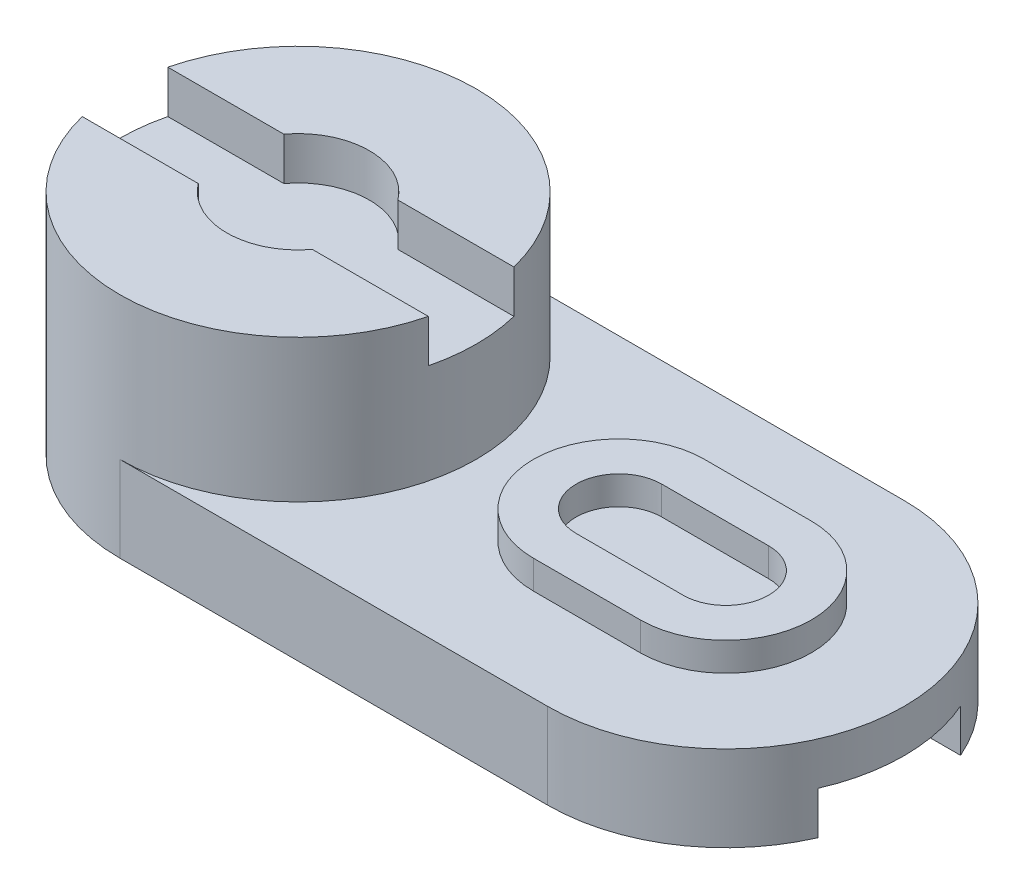
ISO-10303-21;
HEADER;
FILE_DESCRIPTION(('STEP AP214'),'2;1');
FILE_NAME('part.step','',(''),(''),'','','');
FILE_SCHEMA(('AUTOMOTIVE_DESIGN { 1 0 10303 214 1 1 1 1 }'));
ENDSEC;
DATA;
#1=APPLICATION_CONTEXT('core data for automotive mechanical design processes');
#2=APPLICATION_PROTOCOL_DEFINITION('international standard','automotive_design',2000,#1);
#3=PRODUCT_CONTEXT('',#1,'mechanical');
#4=PRODUCT('Part','Part','',(#3));
#5=PRODUCT_RELATED_PRODUCT_CATEGORY('part','',(#4));
#6=PRODUCT_DEFINITION_FORMATION('','',#4);
#7=PRODUCT_DEFINITION_CONTEXT('part definition',#1,'design');
#8=PRODUCT_DEFINITION('design','',#6,#7);
#9=PRODUCT_DEFINITION_SHAPE('','',#8);
#10=(LENGTH_UNIT() NAMED_UNIT(*) SI_UNIT(.MILLI.,.METRE.));
#11=(NAMED_UNIT(*) PLANE_ANGLE_UNIT() SI_UNIT($,.RADIAN.));
#12=(NAMED_UNIT(*) SI_UNIT($,.STERADIAN.) SOLID_ANGLE_UNIT());
#13=UNCERTAINTY_MEASURE_WITH_UNIT(LENGTH_MEASURE(1.E-05),#10,'distance_accuracy_value','');
#14=(GEOMETRIC_REPRESENTATION_CONTEXT(3) GLOBAL_UNCERTAINTY_ASSIGNED_CONTEXT((#13)) GLOBAL_UNIT_ASSIGNED_CONTEXT((#10,
#11,#12)) REPRESENTATION_CONTEXT('',''));
#15=CARTESIAN_POINT('',(0.,0.,0.));
#16=DIRECTION('',(0.,0.,1.));
#17=DIRECTION('',(1.,0.,0.));
#18=AXIS2_PLACEMENT_3D('',#15,#16,#17);
#19=CARTESIAN_POINT('',(-30.,0.,0.));
#20=DIRECTION('',(0.,1.,0.));
#21=DIRECTION('',(0.,0.,1.));
#22=AXIS2_PLACEMENT_3D('',#19,#20,#21);
#23=PLANE('',#22);
#24=CARTESIAN_POINT('',(30.,0.,0.));
#25=DIRECTION('',(0.,1.,0.));
#26=DIRECTION('',(0.,0.,1.));
#27=AXIS2_PLACEMENT_3D('',#24,#25,#26);
#28=CIRCLE('',#27,25.);
#29=CARTESIAN_POINT('',(52.9128784747792,0.,-10.));
#30=VERTEX_POINT('',#29);
#31=CARTESIAN_POINT('',(30.,0.,-25.));
#32=VERTEX_POINT('',#31);
#33=EDGE_CURVE('E226',#30,#32,#28,.T.);
#34=ORIENTED_EDGE('',*,*,#33,.F.);
#35=DIRECTION('',(-1.,0.,0.));
#36=VECTOR('',#35,1.);
#37=CARTESIAN_POINT('',(-30.,0.,-10.));
#38=LINE('',#37,#36);
#39=CARTESIAN_POINT('',(-52.9128784747792,0.,-10.));
#40=VERTEX_POINT('',#39);
#41=EDGE_CURVE('E41',#30,#40,#38,.T.);
#42=ORIENTED_EDGE('',*,*,#41,.T.);
#43=CARTESIAN_POINT('',(-30.,0.,0.));
#44=DIRECTION('',(0.,1.,0.));
#45=DIRECTION('',(0.,0.,1.));
#46=AXIS2_PLACEMENT_3D('',#43,#44,#45);
#47=CIRCLE('',#46,25.);
#48=CARTESIAN_POINT('',(-30.,0.,-25.));
#49=VERTEX_POINT('',#48);
#50=EDGE_CURVE('E215',#49,#40,#47,.T.);
#51=ORIENTED_EDGE('',*,*,#50,.F.);
#52=DIRECTION('',(-1.,0.,0.));
#53=VECTOR('',#52,1.);
#54=CARTESIAN_POINT('',(-30.,0.,-25.));
#55=LINE('',#54,#53);
#56=EDGE_CURVE('E229',#32,#49,#55,.T.);
#57=ORIENTED_EDGE('',*,*,#56,.F.);
#58=EDGE_LOOP('',(#34,#42,#51,#57));
#59=FACE_BOUND('',#58,.T.);
#60=ADVANCED_FACE('F33',(#59),#23,.F.);
#61=CARTESIAN_POINT('',(-57.5,26.,6.));
#62=DIRECTION('',(0.,0.,1.));
#63=DIRECTION('',(1.,0.,0.));
#64=AXIS2_PLACEMENT_3D('',#61,#62,#63);
#65=PLANE('',#64);
#66=DIRECTION('',(0.,-1.,0.));
#67=VECTOR('',#66,1.);
#68=CARTESIAN_POINT('',(-38.,43.,6.));
#69=LINE('',#68,#67);
#70=CARTESIAN_POINT('',(-38.,26.,6.));
#71=VERTEX_POINT('',#70);
#72=CARTESIAN_POINT('',(-38.,32.,6.));
#73=VERTEX_POINT('',#72);
#74=EDGE_CURVE('E295',#71,#73,#69,.F.);
#75=ORIENTED_EDGE('',*,*,#74,.F.);
#76=DIRECTION('',(1.,0.,0.));
#77=VECTOR('',#76,1.);
#78=CARTESIAN_POINT('',(-57.5,26.,6.));
#79=LINE('',#78,#77);
#80=CARTESIAN_POINT('',(-54.2693221990232,26.,6.));
#81=VERTEX_POINT('',#80);
#82=EDGE_CURVE('E302',#81,#71,#79,.T.);
#83=ORIENTED_EDGE('',*,*,#82,.F.);
#84=DIRECTION('',(0.,-1.,0.));
#85=VECTOR('',#84,1.);
#86=CARTESIAN_POINT('',(-54.2693221990232,12.,6.));
#87=LINE('',#86,#85);
#88=CARTESIAN_POINT('',(-54.2693221990232,32.,6.));
#89=VERTEX_POINT('',#88);
#90=EDGE_CURVE('E313',#89,#81,#87,.T.);
#91=ORIENTED_EDGE('',*,*,#90,.F.);
#92=DIRECTION('',(1.,0.,0.));
#93=VECTOR('',#92,1.);
#94=CARTESIAN_POINT('',(-30.,32.,6.));
#95=LINE('',#94,#93);
#96=EDGE_CURVE('E248',#89,#73,#95,.T.);
#97=ORIENTED_EDGE('',*,*,#96,.T.);
#98=EDGE_LOOP('',(#75,#83,#91,#97));
#99=FACE_BOUND('',#98,.T.);
#100=ADVANCED_FACE('F400',(#99),#65,.F.);
#101=DIRECTION('',(0.,-1.,0.));
#102=VECTOR('',#101,1.);
#103=CARTESIAN_POINT('',(-22.,43.,6.));
#104=LINE('',#103,#102);
#105=CARTESIAN_POINT('',(-22.,32.,6.));
#106=VERTEX_POINT('',#105);
#107=CARTESIAN_POINT('',(-22.,26.,6.));
#108=VERTEX_POINT('',#107);
#109=EDGE_CURVE('E290',#106,#108,#104,.T.);
#110=ORIENTED_EDGE('',*,*,#109,.F.);
#111=CARTESIAN_POINT('',(-5.7306778009768,32.,6.));
#112=VERTEX_POINT('',#111);
#113=EDGE_CURVE('E247',#106,#112,#95,.T.);
#114=ORIENTED_EDGE('',*,*,#113,.T.);
#115=DIRECTION('',(0.,-1.,0.));
#116=VECTOR('',#115,1.);
#117=CARTESIAN_POINT('',(-5.7306778009768,12.,6.));
#118=LINE('',#117,#116);
#119=CARTESIAN_POINT('',(-5.7306778009768,26.,6.));
#120=VERTEX_POINT('',#119);
#121=EDGE_CURVE('E310',#120,#112,#118,.F.);
#122=ORIENTED_EDGE('',*,*,#121,.F.);
#123=EDGE_CURVE('E301',#108,#120,#79,.T.);
#124=ORIENTED_EDGE('',*,*,#123,.F.);
#125=EDGE_LOOP('',(#110,#114,#122,#124));
#126=FACE_BOUND('',#125,.T.);
#127=ADVANCED_FACE('F405',(#126),#65,.F.);
#128=CARTESIAN_POINT('',(-57.5,26.,-6.));
#129=DIRECTION('',(0.,0.,-1.));
#130=DIRECTION('',(-1.,0.,0.));
#131=AXIS2_PLACEMENT_3D('',#128,#129,#130);
#132=PLANE('',#131);
#133=DIRECTION('',(0.,-1.,0.));
#134=VECTOR('',#133,1.);
#135=CARTESIAN_POINT('',(-22.,43.,-6.));
#136=LINE('',#135,#134);
#137=CARTESIAN_POINT('',(-22.,26.,-6.));
#138=VERTEX_POINT('',#137);
#139=CARTESIAN_POINT('',(-22.,32.,-6.));
#140=VERTEX_POINT('',#139);
#141=EDGE_CURVE('E200',#138,#140,#136,.F.);
#142=ORIENTED_EDGE('',*,*,#141,.F.);
#143=DIRECTION('',(-1.,0.,0.));
#144=VECTOR('',#143,1.);
#145=CARTESIAN_POINT('',(-57.5,26.,-6.));
#146=LINE('',#145,#144);
#147=CARTESIAN_POINT('',(-5.7306778009768,26.,-6.));
#148=VERTEX_POINT('',#147);
#149=EDGE_CURVE('E298',#148,#138,#146,.T.);
#150=ORIENTED_EDGE('',*,*,#149,.F.);
#151=DIRECTION('',(0.,-1.,0.));
#152=VECTOR('',#151,1.);
#153=CARTESIAN_POINT('',(-5.7306778009768,12.,-6.));
#154=LINE('',#153,#152);
#155=CARTESIAN_POINT('',(-5.73067780097679,32.,-6.));
#156=VERTEX_POINT('',#155);
#157=EDGE_CURVE('E307',#156,#148,#154,.T.);
#158=ORIENTED_EDGE('',*,*,#157,.F.);
#159=DIRECTION('',(-1.,0.,0.));
#160=VECTOR('',#159,1.);
#161=CARTESIAN_POINT('',(-30.,32.,-6.));
#162=LINE('',#161,#160);
#163=EDGE_CURVE('E244',#156,#140,#162,.T.);
#164=ORIENTED_EDGE('',*,*,#163,.T.);
#165=EDGE_LOOP('',(#142,#150,#158,#164));
#166=FACE_BOUND('',#165,.T.);
#167=ADVANCED_FACE('F563',(#166),#132,.F.);
#168=DIRECTION('',(0.,-1.,0.));
#169=VECTOR('',#168,1.);
#170=CARTESIAN_POINT('',(-38.,43.,-6.));
#171=LINE('',#170,#169);
#172=CARTESIAN_POINT('',(-38.,32.,-6.));
#173=VERTEX_POINT('',#172);
#174=CARTESIAN_POINT('',(-38.,26.,-6.));
#175=VERTEX_POINT('',#174);
#176=EDGE_CURVE('E254',#173,#175,#171,.T.);
#177=ORIENTED_EDGE('',*,*,#176,.F.);
#178=CARTESIAN_POINT('',(-54.2693221990232,32.,-6.));
#179=VERTEX_POINT('',#178);
#180=EDGE_CURVE('E243',#173,#179,#162,.T.);
#181=ORIENTED_EDGE('',*,*,#180,.T.);
#182=DIRECTION('',(0.,-1.,0.));
#183=VECTOR('',#182,1.);
#184=CARTESIAN_POINT('',(-54.2693221990232,12.,-6.));
#185=LINE('',#184,#183);
#186=CARTESIAN_POINT('',(-54.2693221990232,26.,-6.));
#187=VERTEX_POINT('',#186);
#188=EDGE_CURVE('E304',#187,#179,#185,.F.);
#189=ORIENTED_EDGE('',*,*,#188,.F.);
#190=EDGE_CURVE('E297',#175,#187,#146,.T.);
#191=ORIENTED_EDGE('',*,*,#190,.F.);
#192=EDGE_LOOP('',(#177,#181,#189,#191));
#193=FACE_BOUND('',#192,.T.);
#194=ADVANCED_FACE('F435',(#193),#132,.F.);
#195=CARTESIAN_POINT('',(-30.,32.,0.));
#196=DIRECTION('',(0.,1.,0.));
#197=DIRECTION('',(0.,0.,1.));
#198=AXIS2_PLACEMENT_3D('',#195,#196,#197);
#199=PLANE('',#198);
#200=ORIENTED_EDGE('',*,*,#113,.F.);
#201=CARTESIAN_POINT('',(-30.,32.,0.));
#202=DIRECTION('',(0.,1.,0.));
#203=DIRECTION('',(0.,0.,1.));
#204=AXIS2_PLACEMENT_3D('',#201,#202,#203);
#205=CIRCLE('',#204,10.);
#206=EDGE_CURVE('E292',#106,#73,#205,.F.);
#207=ORIENTED_EDGE('',*,*,#206,.T.);
#208=ORIENTED_EDGE('',*,*,#96,.F.);
#209=CARTESIAN_POINT('',(-30.,32.,0.));
#210=DIRECTION('',(0.,1.,0.));
#211=DIRECTION('',(0.,0.,1.));
#212=AXIS2_PLACEMENT_3D('',#209,#210,#211);
#213=CIRCLE('',#212,25.);
#214=EDGE_CURVE('E219',#89,#112,#213,.T.);
#215=ORIENTED_EDGE('',*,*,#214,.T.);
#216=EDGE_LOOP('',(#200,#207,#208,#215));
#217=FACE_BOUND('',#216,.T.);
#218=ADVANCED_FACE('F419',(#217),#199,.T.);
#219=CARTESIAN_POINT('',(-30.,12.,0.));
#220=DIRECTION('',(0.,1.,0.));
#221=DIRECTION('',(0.,0.,1.));
#222=AXIS2_PLACEMENT_3D('',#219,#220,#221);
#223=PLANE('',#222);
#224=CARTESIAN_POINT('',(-30.,12.,0.));
#225=DIRECTION('',(0.,1.,0.));
#226=DIRECTION('',(0.,0.,1.));
#227=AXIS2_PLACEMENT_3D('',#224,#225,#226);
#228=CIRCLE('',#227,25.);
#229=CARTESIAN_POINT('',(-30.,12.,25.));
#230=VERTEX_POINT('',#229);
#231=CARTESIAN_POINT('',(-30.,12.,-25.));
#232=VERTEX_POINT('',#231);
#233=EDGE_CURVE('E268',#230,#232,#228,.T.);
#234=ORIENTED_EDGE('',*,*,#233,.F.);
#235=DIRECTION('',(1.,0.,0.));
#236=VECTOR('',#235,1.);
#237=CARTESIAN_POINT('',(-30.,12.,25.));
#238=LINE('',#237,#236);
#239=CARTESIAN_POINT('',(30.,12.,25.));
#240=VERTEX_POINT('',#239);
#241=EDGE_CURVE('E231',#230,#240,#238,.T.);
#242=ORIENTED_EDGE('',*,*,#241,.T.);
#243=CARTESIAN_POINT('',(30.,12.,0.));
#244=DIRECTION('',(0.,1.,0.));
#245=DIRECTION('',(0.,0.,1.));
#246=AXIS2_PLACEMENT_3D('',#243,#244,#245);
#247=CIRCLE('',#246,25.);
#248=CARTESIAN_POINT('',(30.,12.,-25.));
#249=VERTEX_POINT('',#248);
#250=EDGE_CURVE('E277',#240,#249,#247,.T.);
#251=ORIENTED_EDGE('',*,*,#250,.T.);
#252=DIRECTION('',(-1.,0.,0.));
#253=VECTOR('',#252,1.);
#254=CARTESIAN_POINT('',(-30.,12.,-25.));
#255=LINE('',#254,#253);
#256=EDGE_CURVE('E223',#249,#232,#255,.T.);
#257=ORIENTED_EDGE('',*,*,#256,.T.);
#258=EDGE_LOOP('',(#234,#242,#251,#257));
#259=FACE_BOUND('',#258,.T.);
#260=DIRECTION('',(-1.,0.,0.));
#261=VECTOR('',#260,1.);
#262=CARTESIAN_POINT('',(30.,12.,-12.));
#263=LINE('',#262,#261);
#264=CARTESIAN_POINT('',(30.,12.,-12.));
#265=VERTEX_POINT('',#264);
#266=CARTESIAN_POINT('',(15.,12.,-12.));
#267=VERTEX_POINT('',#266);
#268=EDGE_CURVE('E359',#265,#267,#263,.T.);
#269=ORIENTED_EDGE('',*,*,#268,.F.);
#270=CARTESIAN_POINT('',(30.,12.,0.));
#271=DIRECTION('',(0.,1.,0.));
#272=DIRECTION('',(0.,0.,1.));
#273=AXIS2_PLACEMENT_3D('',#270,#271,#272);
#274=CIRCLE('',#273,12.);
#275=CARTESIAN_POINT('',(30.,12.,12.));
#276=VERTEX_POINT('',#275);
#277=EDGE_CURVE('E345',#276,#265,#274,.T.);
#278=ORIENTED_EDGE('',*,*,#277,.F.);
#279=DIRECTION('',(1.,0.,0.));
#280=VECTOR('',#279,1.);
#281=CARTESIAN_POINT('',(30.,12.,12.));
#282=LINE('',#281,#280);
#283=CARTESIAN_POINT('',(15.,12.,12.));
#284=VERTEX_POINT('',#283);
#285=EDGE_CURVE('E350',#284,#276,#282,.T.);
#286=ORIENTED_EDGE('',*,*,#285,.F.);
#287=CARTESIAN_POINT('',(15.,12.,0.));
#288=DIRECTION('',(0.,1.,0.));
#289=DIRECTION('',(0.,0.,1.));
#290=AXIS2_PLACEMENT_3D('',#287,#288,#289);
#291=CIRCLE('',#290,12.);
#292=EDGE_CURVE('E361',#267,#284,#291,.T.);
#293=ORIENTED_EDGE('',*,*,#292,.F.);
#294=EDGE_LOOP('',(#269,#278,#286,#293));
#295=FACE_BOUND('',#294,.T.);
#296=ADVANCED_FACE('F377',(#259,#295),#223,.T.);
#297=CARTESIAN_POINT('',(-30.,12.,0.));
#298=DIRECTION('',(0.,-1.,0.));
#299=DIRECTION('',(0.,0.,-1.));
#300=AXIS2_PLACEMENT_3D('',#297,#298,#299);
#301=CYLINDRICAL_SURFACE('',#300,25.);
#302=ORIENTED_EDGE('',*,*,#50,.T.);
#303=DIRECTION('',(0.,-1.,0.));
#304=VECTOR('',#303,1.);
#305=CARTESIAN_POINT('',(-52.9128784747792,12.,-10.));
#306=LINE('',#305,#304);
#307=CARTESIAN_POINT('',(-52.9128784747792,6.,-10.));
#308=VERTEX_POINT('',#307);
#309=EDGE_CURVE('E264',#40,#308,#306,.F.);
#310=ORIENTED_EDGE('',*,*,#309,.T.);
#311=CARTESIAN_POINT('',(-30.,6.,0.));
#312=DIRECTION('',(0.,-1.,0.));
#313=DIRECTION('',(0.,0.,-1.));
#314=AXIS2_PLACEMENT_3D('',#311,#312,#313);
#315=CIRCLE('',#314,25.);
#316=CARTESIAN_POINT('',(-52.9128784747792,6.,10.));
#317=VERTEX_POINT('',#316);
#318=EDGE_CURVE('E209',#317,#308,#315,.T.);
#319=ORIENTED_EDGE('',*,*,#318,.F.);
#320=DIRECTION('',(0.,-1.,0.));
#321=VECTOR('',#320,1.);
#322=CARTESIAN_POINT('',(-52.9128784747792,12.,10.));
#323=LINE('',#322,#321);
#324=CARTESIAN_POINT('',(-52.9128784747792,0.,10.));
#325=VERTEX_POINT('',#324);
#326=EDGE_CURVE('E194',#317,#325,#323,.T.);
#327=ORIENTED_EDGE('',*,*,#326,.T.);
#328=CARTESIAN_POINT('',(-30.,0.,25.));
#329=VERTEX_POINT('',#328);
#330=EDGE_CURVE('E206',#325,#329,#47,.T.);
#331=ORIENTED_EDGE('',*,*,#330,.T.);
#332=DIRECTION('',(0.,-1.,0.));
#333=VECTOR('',#332,1.);
#334=CARTESIAN_POINT('',(-30.,12.,25.));
#335=LINE('',#334,#333);
#336=EDGE_CURVE('E241',#230,#329,#335,.T.);
#337=ORIENTED_EDGE('',*,*,#336,.F.);
#338=ORIENTED_EDGE('',*,*,#233,.T.);
#339=DIRECTION('',(0.,-1.,0.));
#340=VECTOR('',#339,1.);
#341=CARTESIAN_POINT('',(-30.,12.,-25.));
#342=LINE('',#341,#340);
#343=EDGE_CURVE('E232',#232,#49,#342,.T.);
#344=ORIENTED_EDGE('',*,*,#343,.T.);
#345=EDGE_LOOP('',(#302,#310,#319,#327,#331,#337,#338,#344));
#346=FACE_BOUND('',#345,.T.);
#347=CARTESIAN_POINT('',(-30.,26.,0.));
#348=DIRECTION('',(0.,1.,0.));
#349=DIRECTION('',(0.,0.,1.));
#350=AXIS2_PLACEMENT_3D('',#347,#348,#349);
#351=CIRCLE('',#350,25.);
#352=EDGE_CURVE('E253',#120,#148,#351,.T.);
#353=ORIENTED_EDGE('',*,*,#352,.F.);
#354=ORIENTED_EDGE('',*,*,#121,.T.);
#355=ORIENTED_EDGE('',*,*,#214,.F.);
#356=ORIENTED_EDGE('',*,*,#90,.T.);
#357=EDGE_CURVE('E251',#187,#81,#351,.T.);
#358=ORIENTED_EDGE('',*,*,#357,.F.);
#359=ORIENTED_EDGE('',*,*,#188,.T.);
#360=EDGE_CURVE('E216',#156,#179,#213,.T.);
#361=ORIENTED_EDGE('',*,*,#360,.F.);
#362=ORIENTED_EDGE('',*,*,#157,.T.);
#363=EDGE_LOOP('',(#353,#354,#355,#356,#358,#359,#361,#362));
#364=FACE_BOUND('',#363,.T.);
#365=ADVANCED_FACE('F35',(#346,#364),#301,.T.);
#366=CARTESIAN_POINT('',(-30.,12.,25.));
#367=DIRECTION('',(0.,0.,-1.));
#368=DIRECTION('',(-1.,0.,0.));
#369=AXIS2_PLACEMENT_3D('',#366,#367,#368);
#370=PLANE('',#369);
#371=DIRECTION('',(1.,0.,0.));
#372=VECTOR('',#371,1.);
#373=CARTESIAN_POINT('',(-30.,0.,25.));
#374=LINE('',#373,#372);
#375=CARTESIAN_POINT('',(30.,0.,25.));
#376=VERTEX_POINT('',#375);
#377=EDGE_CURVE('E213',#329,#376,#374,.T.);
#378=ORIENTED_EDGE('',*,*,#377,.T.);
#379=DIRECTION('',(0.,-1.,0.));
#380=VECTOR('',#379,1.);
#381=CARTESIAN_POINT('',(30.,12.,25.));
#382=LINE('',#381,#380);
#383=EDGE_CURVE('E238',#240,#376,#382,.T.);
#384=ORIENTED_EDGE('',*,*,#383,.F.);
#385=ORIENTED_EDGE('',*,*,#241,.F.);
#386=ORIENTED_EDGE('',*,*,#336,.T.);
#387=EDGE_LOOP('',(#378,#384,#385,#386));
#388=FACE_BOUND('',#387,.T.);
#389=ADVANCED_FACE('F382',(#388),#370,.F.);
#390=CARTESIAN_POINT('',(30.,12.,0.));
#391=DIRECTION('',(0.,-1.,0.));
#392=DIRECTION('',(0.,0.,-1.));
#393=AXIS2_PLACEMENT_3D('',#390,#391,#392);
#394=CYLINDRICAL_SURFACE('',#393,25.);
#395=CARTESIAN_POINT('',(30.,6.,0.));
#396=DIRECTION('',(0.,-1.,0.));
#397=DIRECTION('',(0.,0.,-1.));
#398=AXIS2_PLACEMENT_3D('',#395,#396,#397);
#399=CIRCLE('',#398,25.);
#400=CARTESIAN_POINT('',(52.9128784747792,6.,-10.));
#401=VERTEX_POINT('',#400);
#402=CARTESIAN_POINT('',(52.9128784747792,6.,10.));
#403=VERTEX_POINT('',#402);
#404=EDGE_CURVE('E11',#401,#403,#399,.T.);
#405=ORIENTED_EDGE('',*,*,#404,.F.);
#406=DIRECTION('',(0.,-1.,0.));
#407=VECTOR('',#406,1.);
#408=CARTESIAN_POINT('',(52.9128784747792,12.,-10.));
#409=LINE('',#408,#407);
#410=EDGE_CURVE('E210',#401,#30,#409,.T.);
#411=ORIENTED_EDGE('',*,*,#410,.T.);
#412=ORIENTED_EDGE('',*,*,#33,.T.);
#413=DIRECTION('',(0.,-1.,0.));
#414=VECTOR('',#413,1.);
#415=CARTESIAN_POINT('',(30.,12.,-25.));
#416=LINE('',#415,#414);
#417=EDGE_CURVE('E235',#249,#32,#416,.T.);
#418=ORIENTED_EDGE('',*,*,#417,.F.);
#419=ORIENTED_EDGE('',*,*,#250,.F.);
#420=ORIENTED_EDGE('',*,*,#383,.T.);
#421=CARTESIAN_POINT('',(52.9128784747792,0.,10.));
#422=VERTEX_POINT('',#421);
#423=EDGE_CURVE('E227',#376,#422,#28,.T.);
#424=ORIENTED_EDGE('',*,*,#423,.T.);
#425=DIRECTION('',(0.,-1.,0.));
#426=VECTOR('',#425,1.);
#427=CARTESIAN_POINT('',(52.9128784747792,12.,10.));
#428=LINE('',#427,#426);
#429=EDGE_CURVE('E48',#422,#403,#428,.F.);
#430=ORIENTED_EDGE('',*,*,#429,.T.);
#431=EDGE_LOOP('',(#405,#411,#412,#418,#419,#420,#424,#430));
#432=FACE_BOUND('',#431,.T.);
#433=ADVANCED_FACE('F276',(#432),#394,.T.);
#434=CARTESIAN_POINT('',(-30.,12.,-25.));
#435=DIRECTION('',(0.,0.,1.));
#436=DIRECTION('',(1.,0.,0.));
#437=AXIS2_PLACEMENT_3D('',#434,#435,#436);
#438=PLANE('',#437);
#439=ORIENTED_EDGE('',*,*,#56,.T.);
#440=ORIENTED_EDGE('',*,*,#343,.F.);
#441=ORIENTED_EDGE('',*,*,#256,.F.);
#442=ORIENTED_EDGE('',*,*,#417,.T.);
#443=EDGE_LOOP('',(#439,#440,#441,#442));
#444=FACE_BOUND('',#443,.T.);
#445=ADVANCED_FACE('F271',(#444),#438,.F.);
#446=ORIENTED_EDGE('',*,*,#330,.F.);
#447=DIRECTION('',(1.,0.,0.));
#448=VECTOR('',#447,1.);
#449=CARTESIAN_POINT('',(-30.,0.,10.));
#450=LINE('',#449,#448);
#451=EDGE_CURVE('E191',#325,#422,#450,.T.);
#452=ORIENTED_EDGE('',*,*,#451,.T.);
#453=ORIENTED_EDGE('',*,*,#423,.F.);
#454=ORIENTED_EDGE('',*,*,#377,.F.);
#455=EDGE_LOOP('',(#446,#452,#453,#454));
#456=FACE_BOUND('',#455,.T.);
#457=ADVANCED_FACE('F212',(#456),#23,.F.);
#458=ORIENTED_EDGE('',*,*,#180,.F.);
#459=CARTESIAN_POINT('',(-30.,32.,0.));
#460=DIRECTION('',(0.,1.,0.));
#461=DIRECTION('',(0.,0.,1.));
#462=AXIS2_PLACEMENT_3D('',#459,#460,#461);
#463=CIRCLE('',#462,10.);
#464=EDGE_CURVE('E287',#173,#140,#463,.F.);
#465=ORIENTED_EDGE('',*,*,#464,.T.);
#466=ORIENTED_EDGE('',*,*,#163,.F.);
#467=ORIENTED_EDGE('',*,*,#360,.T.);
#468=EDGE_LOOP('',(#458,#465,#466,#467));
#469=FACE_BOUND('',#468,.T.);
#470=ADVANCED_FACE('F411',(#469),#199,.T.);
#471=CARTESIAN_POINT('',(30.,16.,0.));
#472=DIRECTION('',(0.,1.,0.));
#473=DIRECTION('',(0.,0.,1.));
#474=AXIS2_PLACEMENT_3D('',#471,#472,#473);
#475=PLANE('',#474);
#476=CARTESIAN_POINT('',(30.,16.,0.));
#477=DIRECTION('',(0.,1.,0.));
#478=DIRECTION('',(0.,0.,1.));
#479=AXIS2_PLACEMENT_3D('',#476,#477,#478);
#480=CIRCLE('',#479,12.);
#481=CARTESIAN_POINT('',(30.,16.,12.));
#482=VERTEX_POINT('',#481);
#483=CARTESIAN_POINT('',(30.,16.,-12.));
#484=VERTEX_POINT('',#483);
#485=EDGE_CURVE('E346',#482,#484,#480,.T.);
#486=ORIENTED_EDGE('',*,*,#485,.T.);
#487=DIRECTION('',(-1.,0.,0.));
#488=VECTOR('',#487,1.);
#489=CARTESIAN_POINT('',(30.,16.,-12.));
#490=LINE('',#489,#488);
#491=CARTESIAN_POINT('',(15.,16.,-12.));
#492=VERTEX_POINT('',#491);
#493=EDGE_CURVE('E349',#484,#492,#490,.T.);
#494=ORIENTED_EDGE('',*,*,#493,.T.);
#495=CARTESIAN_POINT('',(15.,16.,0.));
#496=DIRECTION('',(0.,1.,0.));
#497=DIRECTION('',(0.,0.,1.));
#498=AXIS2_PLACEMENT_3D('',#495,#496,#497);
#499=CIRCLE('',#498,12.);
#500=CARTESIAN_POINT('',(15.,16.,12.));
#501=VERTEX_POINT('',#500);
#502=EDGE_CURVE('E352',#492,#501,#499,.T.);
#503=ORIENTED_EDGE('',*,*,#502,.T.);
#504=DIRECTION('',(1.,0.,0.));
#505=VECTOR('',#504,1.);
#506=CARTESIAN_POINT('',(30.,16.,12.));
#507=LINE('',#506,#505);
#508=EDGE_CURVE('E354',#501,#482,#507,.T.);
#509=ORIENTED_EDGE('',*,*,#508,.T.);
#510=EDGE_LOOP('',(#486,#494,#503,#509));
#511=FACE_BOUND('',#510,.T.);
#512=DIRECTION('',(-1.,0.,0.));
#513=VECTOR('',#512,1.);
#514=CARTESIAN_POINT('',(30.,16.,-6.));
#515=LINE('',#514,#513);
#516=CARTESIAN_POINT('',(30.,16.,-6.));
#517=VERTEX_POINT('',#516);
#518=CARTESIAN_POINT('',(15.,16.,-6.));
#519=VERTEX_POINT('',#518);
#520=EDGE_CURVE('E319',#517,#519,#515,.T.);
#521=ORIENTED_EDGE('',*,*,#520,.F.);
#522=CARTESIAN_POINT('',(30.,16.,0.));
#523=DIRECTION('',(0.,1.,0.));
#524=DIRECTION('',(0.,0.,1.));
#525=AXIS2_PLACEMENT_3D('',#522,#523,#524);
#526=CIRCLE('',#525,6.);
#527=CARTESIAN_POINT('',(30.,16.,6.));
#528=VERTEX_POINT('',#527);
#529=EDGE_CURVE('E317',#528,#517,#526,.T.);
#530=ORIENTED_EDGE('',*,*,#529,.F.);
#531=DIRECTION('',(1.,0.,0.));
#532=VECTOR('',#531,1.);
#533=CARTESIAN_POINT('',(30.,16.,6.));
#534=LINE('',#533,#532);
#535=CARTESIAN_POINT('',(15.,16.,6.));
#536=VERTEX_POINT('',#535);
#537=EDGE_CURVE('E325',#536,#528,#534,.T.);
#538=ORIENTED_EDGE('',*,*,#537,.F.);
#539=CARTESIAN_POINT('',(15.,16.,0.));
#540=DIRECTION('',(0.,1.,0.));
#541=DIRECTION('',(0.,0.,1.));
#542=AXIS2_PLACEMENT_3D('',#539,#540,#541);
#543=CIRCLE('',#542,6.);
#544=EDGE_CURVE('E322',#519,#536,#543,.T.);
#545=ORIENTED_EDGE('',*,*,#544,.F.);
#546=EDGE_LOOP('',(#521,#530,#538,#545));
#547=FACE_BOUND('',#546,.T.);
#548=ADVANCED_FACE('F416',(#511,#547),#475,.T.);
#549=CARTESIAN_POINT('',(30.,16.,0.));
#550=DIRECTION('',(0.,-1.,0.));
#551=DIRECTION('',(0.,0.,-1.));
#552=AXIS2_PLACEMENT_3D('',#549,#550,#551);
#553=CYLINDRICAL_SURFACE('',#552,12.);
#554=ORIENTED_EDGE('',*,*,#277,.T.);
#555=DIRECTION('',(0.,-1.,0.));
#556=VECTOR('',#555,1.);
#557=CARTESIAN_POINT('',(30.,16.,-12.));
#558=LINE('',#557,#556);
#559=EDGE_CURVE('E372',#484,#265,#558,.T.);
#560=ORIENTED_EDGE('',*,*,#559,.F.);
#561=ORIENTED_EDGE('',*,*,#485,.F.);
#562=DIRECTION('',(0.,-1.,0.));
#563=VECTOR('',#562,1.);
#564=CARTESIAN_POINT('',(30.,16.,12.));
#565=LINE('',#564,#563);
#566=EDGE_CURVE('E356',#482,#276,#565,.T.);
#567=ORIENTED_EDGE('',*,*,#566,.T.);
#568=EDGE_LOOP('',(#554,#560,#561,#567));
#569=FACE_BOUND('',#568,.T.);
#570=ADVANCED_FACE('F480',(#569),#553,.T.);
#571=CARTESIAN_POINT('',(30.,16.,-12.));
#572=DIRECTION('',(0.,0.,1.));
#573=DIRECTION('',(1.,0.,0.));
#574=AXIS2_PLACEMENT_3D('',#571,#572,#573);
#575=PLANE('',#574);
#576=ORIENTED_EDGE('',*,*,#268,.T.);
#577=DIRECTION('',(0.,-1.,0.));
#578=VECTOR('',#577,1.);
#579=CARTESIAN_POINT('',(15.,16.,-12.));
#580=LINE('',#579,#578);
#581=EDGE_CURVE('E369',#492,#267,#580,.T.);
#582=ORIENTED_EDGE('',*,*,#581,.F.);
#583=ORIENTED_EDGE('',*,*,#493,.F.);
#584=ORIENTED_EDGE('',*,*,#559,.T.);
#585=EDGE_LOOP('',(#576,#582,#583,#584));
#586=FACE_BOUND('',#585,.T.);
#587=ADVANCED_FACE('F488',(#586),#575,.F.);
#588=CARTESIAN_POINT('',(15.,16.,0.));
#589=DIRECTION('',(0.,-1.,0.));
#590=DIRECTION('',(0.,0.,-1.));
#591=AXIS2_PLACEMENT_3D('',#588,#589,#590);
#592=CYLINDRICAL_SURFACE('',#591,12.);
#593=ORIENTED_EDGE('',*,*,#292,.T.);
#594=DIRECTION('',(0.,-1.,0.));
#595=VECTOR('',#594,1.);
#596=CARTESIAN_POINT('',(15.,16.,12.));
#597=LINE('',#596,#595);
#598=EDGE_CURVE('E367',#501,#284,#597,.T.);
#599=ORIENTED_EDGE('',*,*,#598,.F.);
#600=ORIENTED_EDGE('',*,*,#502,.F.);
#601=ORIENTED_EDGE('',*,*,#581,.T.);
#602=EDGE_LOOP('',(#593,#599,#600,#601));
#603=FACE_BOUND('',#602,.T.);
#604=ADVANCED_FACE('F484',(#603),#592,.T.);
#605=CARTESIAN_POINT('',(30.,16.,12.));
#606=DIRECTION('',(0.,0.,-1.));
#607=DIRECTION('',(-1.,0.,0.));
#608=AXIS2_PLACEMENT_3D('',#605,#606,#607);
#609=PLANE('',#608);
#610=ORIENTED_EDGE('',*,*,#285,.T.);
#611=ORIENTED_EDGE('',*,*,#566,.F.);
#612=ORIENTED_EDGE('',*,*,#508,.F.);
#613=ORIENTED_EDGE('',*,*,#598,.T.);
#614=EDGE_LOOP('',(#610,#611,#612,#613));
#615=FACE_BOUND('',#614,.T.);
#616=ADVANCED_FACE('F477',(#615),#609,.F.);
#617=CARTESIAN_POINT('',(30.,16.,0.));
#618=DIRECTION('',(0.,-1.,0.));
#619=DIRECTION('',(0.,0.,-1.));
#620=AXIS2_PLACEMENT_3D('',#617,#618,#619);
#621=CYLINDRICAL_SURFACE('',#620,6.);
#622=CARTESIAN_POINT('',(30.,12.,0.));
#623=DIRECTION('',(0.,1.,0.));
#624=DIRECTION('',(0.,0.,1.));
#625=AXIS2_PLACEMENT_3D('',#622,#623,#624);
#626=CIRCLE('',#625,6.);
#627=CARTESIAN_POINT('',(30.,12.,6.));
#628=VERTEX_POINT('',#627);
#629=CARTESIAN_POINT('',(30.,12.,-6.));
#630=VERTEX_POINT('',#629);
#631=EDGE_CURVE('E316',#628,#630,#626,.T.);
#632=ORIENTED_EDGE('',*,*,#631,.F.);
#633=DIRECTION('',(0.,-1.,0.));
#634=VECTOR('',#633,1.);
#635=CARTESIAN_POINT('',(30.,16.,6.));
#636=LINE('',#635,#634);
#637=EDGE_CURVE('E327',#528,#628,#636,.T.);
#638=ORIENTED_EDGE('',*,*,#637,.F.);
#639=ORIENTED_EDGE('',*,*,#529,.T.);
#640=DIRECTION('',(0.,-1.,0.));
#641=VECTOR('',#640,1.);
#642=CARTESIAN_POINT('',(30.,16.,-6.));
#643=LINE('',#642,#641);
#644=EDGE_CURVE('E342',#517,#630,#643,.T.);
#645=ORIENTED_EDGE('',*,*,#644,.T.);
#646=EDGE_LOOP('',(#632,#638,#639,#645));
#647=FACE_BOUND('',#646,.T.);
#648=ADVANCED_FACE('F461',(#647),#621,.F.);
#649=CARTESIAN_POINT('',(30.,16.,-6.));
#650=DIRECTION('',(0.,0.,1.));
#651=DIRECTION('',(1.,0.,0.));
#652=AXIS2_PLACEMENT_3D('',#649,#650,#651);
#653=PLANE('',#652);
#654=DIRECTION('',(-1.,0.,0.));
#655=VECTOR('',#654,1.);
#656=CARTESIAN_POINT('',(30.,12.,-6.));
#657=LINE('',#656,#655);
#658=CARTESIAN_POINT('',(15.,12.,-6.));
#659=VERTEX_POINT('',#658);
#660=EDGE_CURVE('E329',#630,#659,#657,.T.);
#661=ORIENTED_EDGE('',*,*,#660,.F.);
#662=ORIENTED_EDGE('',*,*,#644,.F.);
#663=ORIENTED_EDGE('',*,*,#520,.T.);
#664=DIRECTION('',(0.,-1.,0.));
#665=VECTOR('',#664,1.);
#666=CARTESIAN_POINT('',(15.,16.,-6.));
#667=LINE('',#666,#665);
#668=EDGE_CURVE('E339',#519,#659,#667,.T.);
#669=ORIENTED_EDGE('',*,*,#668,.T.);
#670=EDGE_LOOP('',(#661,#662,#663,#669));
#671=FACE_BOUND('',#670,.T.);
#672=ADVANCED_FACE('F457',(#671),#653,.T.);
#673=CARTESIAN_POINT('',(15.,16.,0.));
#674=DIRECTION('',(0.,-1.,0.));
#675=DIRECTION('',(0.,0.,-1.));
#676=AXIS2_PLACEMENT_3D('',#673,#674,#675);
#677=CYLINDRICAL_SURFACE('',#676,6.);
#678=CARTESIAN_POINT('',(15.,12.,0.));
#679=DIRECTION('',(0.,1.,0.));
#680=DIRECTION('',(0.,0.,1.));
#681=AXIS2_PLACEMENT_3D('',#678,#679,#680);
#682=CIRCLE('',#681,6.);
#683=CARTESIAN_POINT('',(15.,12.,6.));
#684=VERTEX_POINT('',#683);
#685=EDGE_CURVE('E331',#659,#684,#682,.T.);
#686=ORIENTED_EDGE('',*,*,#685,.F.);
#687=ORIENTED_EDGE('',*,*,#668,.F.);
#688=ORIENTED_EDGE('',*,*,#544,.T.);
#689=DIRECTION('',(0.,-1.,0.));
#690=VECTOR('',#689,1.);
#691=CARTESIAN_POINT('',(15.,16.,6.));
#692=LINE('',#691,#690);
#693=EDGE_CURVE('E336',#536,#684,#692,.T.);
#694=ORIENTED_EDGE('',*,*,#693,.T.);
#695=EDGE_LOOP('',(#686,#687,#688,#694));
#696=FACE_BOUND('',#695,.T.);
#697=ADVANCED_FACE('F447',(#696),#677,.F.);
#698=CARTESIAN_POINT('',(30.,16.,6.));
#699=DIRECTION('',(0.,0.,-1.));
#700=DIRECTION('',(-1.,0.,0.));
#701=AXIS2_PLACEMENT_3D('',#698,#699,#700);
#702=PLANE('',#701);
#703=DIRECTION('',(1.,0.,0.));
#704=VECTOR('',#703,1.);
#705=CARTESIAN_POINT('',(30.,12.,6.));
#706=LINE('',#705,#704);
#707=EDGE_CURVE('E320',#684,#628,#706,.T.);
#708=ORIENTED_EDGE('',*,*,#707,.F.);
#709=ORIENTED_EDGE('',*,*,#693,.F.);
#710=ORIENTED_EDGE('',*,*,#537,.T.);
#711=ORIENTED_EDGE('',*,*,#637,.T.);
#712=EDGE_LOOP('',(#708,#709,#710,#711));
#713=FACE_BOUND('',#712,.T.);
#714=ADVANCED_FACE('F439',(#713),#702,.T.);
#715=ORIENTED_EDGE('',*,*,#631,.T.);
#716=ORIENTED_EDGE('',*,*,#660,.T.);
#717=ORIENTED_EDGE('',*,*,#685,.T.);
#718=ORIENTED_EDGE('',*,*,#707,.T.);
#719=EDGE_LOOP('',(#715,#716,#717,#718));
#720=FACE_BOUND('',#719,.T.);
#721=ADVANCED_FACE('F431',(#720),#223,.T.);
#722=CARTESIAN_POINT('',(0.,26.,0.));
#723=DIRECTION('',(0.,1.,0.));
#724=DIRECTION('',(0.,0.,1.));
#725=AXIS2_PLACEMENT_3D('',#722,#723,#724);
#726=PLANE('',#725);
#727=ORIENTED_EDGE('',*,*,#149,.T.);
#728=CARTESIAN_POINT('',(-30.,26.,0.));
#729=DIRECTION('',(0.,1.,0.));
#730=DIRECTION('',(0.,0.,1.));
#731=AXIS2_PLACEMENT_3D('',#728,#729,#730);
#732=CIRCLE('',#731,10.);
#733=EDGE_CURVE('E286',#138,#175,#732,.T.);
#734=ORIENTED_EDGE('',*,*,#733,.T.);
#735=ORIENTED_EDGE('',*,*,#190,.T.);
#736=ORIENTED_EDGE('',*,*,#357,.T.);
#737=ORIENTED_EDGE('',*,*,#82,.T.);
#738=EDGE_CURVE('E56',#71,#108,#732,.T.);
#739=ORIENTED_EDGE('',*,*,#738,.T.);
#740=ORIENTED_EDGE('',*,*,#123,.T.);
#741=ORIENTED_EDGE('',*,*,#352,.T.);
#742=EDGE_LOOP('',(#727,#734,#735,#736,#737,#739,#740,#741));
#743=FACE_BOUND('',#742,.T.);
#744=ADVANCED_FACE('F438',(#743),#726,.T.);
#745=CARTESIAN_POINT('',(-30.,43.,0.));
#746=DIRECTION('',(0.,-1.,0.));
#747=DIRECTION('',(0.,0.,-1.));
#748=AXIS2_PLACEMENT_3D('',#745,#746,#747);
#749=CYLINDRICAL_SURFACE('',#748,10.);
#750=ORIENTED_EDGE('',*,*,#141,.T.);
#751=ORIENTED_EDGE('',*,*,#464,.F.);
#752=ORIENTED_EDGE('',*,*,#176,.T.);
#753=ORIENTED_EDGE('',*,*,#733,.F.);
#754=EDGE_LOOP('',(#750,#751,#752,#753));
#755=FACE_BOUND('',#754,.T.);
#756=ADVANCED_FACE('F445',(#755),#749,.F.);
#757=ORIENTED_EDGE('',*,*,#74,.T.);
#758=ORIENTED_EDGE('',*,*,#206,.F.);
#759=ORIENTED_EDGE('',*,*,#109,.T.);
#760=ORIENTED_EDGE('',*,*,#738,.F.);
#761=EDGE_LOOP('',(#757,#758,#759,#760));
#762=FACE_BOUND('',#761,.T.);
#763=ADVANCED_FACE('F397',(#762),#749,.F.);
#764=CARTESIAN_POINT('',(0.,6.,0.));
#765=DIRECTION('',(0.,-1.,0.));
#766=DIRECTION('',(0.,0.,-1.));
#767=AXIS2_PLACEMENT_3D('',#764,#765,#766);
#768=PLANE('',#767);
#769=ORIENTED_EDGE('',*,*,#318,.T.);
#770=DIRECTION('',(1.,0.,0.));
#771=VECTOR('',#770,1.);
#772=CARTESIAN_POINT('',(-62.5,6.,-10.));
#773=LINE('',#772,#771);
#774=EDGE_CURVE('E383',#308,#401,#773,.T.);
#775=ORIENTED_EDGE('',*,*,#774,.T.);
#776=ORIENTED_EDGE('',*,*,#404,.T.);
#777=DIRECTION('',(-1.,0.,0.));
#778=VECTOR('',#777,1.);
#779=CARTESIAN_POINT('',(-62.5,6.,10.));
#780=LINE('',#779,#778);
#781=EDGE_CURVE('E384',#403,#317,#780,.T.);
#782=ORIENTED_EDGE('',*,*,#781,.T.);
#783=EDGE_LOOP('',(#769,#775,#776,#782));
#784=FACE_BOUND('',#783,.T.);
#785=ADVANCED_FACE('F388',(#784),#768,.T.);
#786=CARTESIAN_POINT('',(-62.5,6.,-10.));
#787=DIRECTION('',(0.,0.,-1.));
#788=DIRECTION('',(-1.,0.,0.));
#789=AXIS2_PLACEMENT_3D('',#786,#787,#788);
#790=PLANE('',#789);
#791=ORIENTED_EDGE('',*,*,#41,.F.);
#792=ORIENTED_EDGE('',*,*,#410,.F.);
#793=ORIENTED_EDGE('',*,*,#774,.F.);
#794=ORIENTED_EDGE('',*,*,#309,.F.);
#795=EDGE_LOOP('',(#791,#792,#793,#794));
#796=FACE_BOUND('',#795,.T.);
#797=ADVANCED_FACE('F389',(#796),#790,.F.);
#798=CARTESIAN_POINT('',(-62.5,6.,10.));
#799=DIRECTION('',(0.,0.,1.));
#800=DIRECTION('',(1.,0.,0.));
#801=AXIS2_PLACEMENT_3D('',#798,#799,#800);
#802=PLANE('',#801);
#803=ORIENTED_EDGE('',*,*,#781,.F.);
#804=ORIENTED_EDGE('',*,*,#429,.F.);
#805=ORIENTED_EDGE('',*,*,#451,.F.);
#806=ORIENTED_EDGE('',*,*,#326,.F.);
#807=EDGE_LOOP('',(#803,#804,#805,#806));
#808=FACE_BOUND('',#807,.T.);
#809=ADVANCED_FACE('F193',(#808),#802,.F.);
#810=CLOSED_SHELL('',(#60,#100,#127,#167,#194,#218,#296,#365,#389,#433,#445,#457,#470,#548,#570,
#587,#604,#616,#648,#672,#697,#714,#721,#744,#756,#763,#785,#797,#809));
#811=MANIFOLD_SOLID_BREP('B2',#810);
#812=ADVANCED_BREP_SHAPE_REPRESENTATION('',(#18,#811),#14);
#813=SHAPE_DEFINITION_REPRESENTATION(#9,#812);
ENDSEC;
END-ISO-10303-21;
